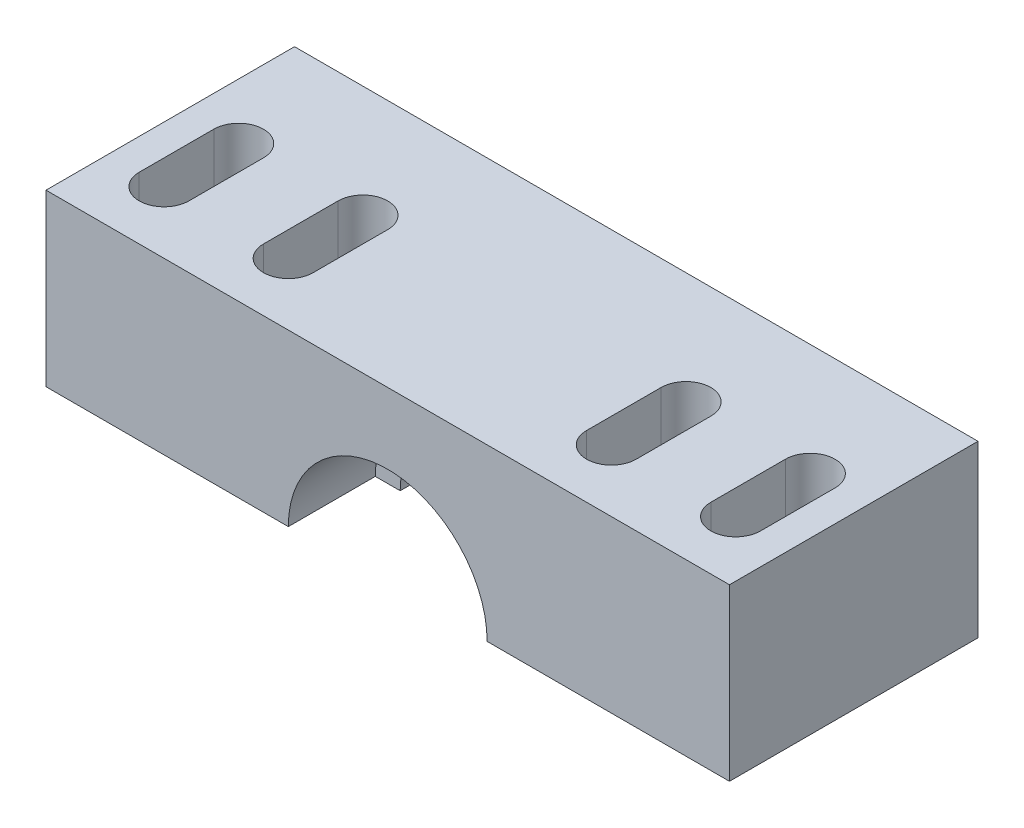
ISO-10303-21;
HEADER;
FILE_DESCRIPTION(('STEP AP214'),'2;1');
FILE_NAME('part.step','',(''),(''),'','','');
FILE_SCHEMA(('AUTOMOTIVE_DESIGN { 1 0 10303 214 1 1 1 1 }'));
ENDSEC;
DATA;
#1=APPLICATION_CONTEXT('core data for automotive mechanical design processes');
#2=APPLICATION_PROTOCOL_DEFINITION('international standard','automotive_design',2000,#1);
#3=PRODUCT_CONTEXT('',#1,'mechanical');
#4=PRODUCT('Part','Part','',(#3));
#5=PRODUCT_RELATED_PRODUCT_CATEGORY('part','',(#4));
#6=PRODUCT_DEFINITION_FORMATION('','',#4);
#7=PRODUCT_DEFINITION_CONTEXT('part definition',#1,'design');
#8=PRODUCT_DEFINITION('design','',#6,#7);
#9=PRODUCT_DEFINITION_SHAPE('','',#8);
#10=(LENGTH_UNIT() NAMED_UNIT(*) SI_UNIT(.MILLI.,.METRE.));
#11=(NAMED_UNIT(*) PLANE_ANGLE_UNIT() SI_UNIT($,.RADIAN.));
#12=(NAMED_UNIT(*) SI_UNIT($,.STERADIAN.) SOLID_ANGLE_UNIT());
#13=UNCERTAINTY_MEASURE_WITH_UNIT(LENGTH_MEASURE(1.E-05),#10,'distance_accuracy_value','');
#14=(GEOMETRIC_REPRESENTATION_CONTEXT(3) GLOBAL_UNCERTAINTY_ASSIGNED_CONTEXT((#13)) GLOBAL_UNIT_ASSIGNED_CONTEXT((#10,
#11,#12)) REPRESENTATION_CONTEXT('',''));
#15=CARTESIAN_POINT('',(0.,0.,0.));
#16=DIRECTION('',(0.,0.,1.));
#17=DIRECTION('',(1.,0.,0.));
#18=AXIS2_PLACEMENT_3D('',#15,#16,#17);
#19=CARTESIAN_POINT('',(-20.,0.,0.));
#20=DIRECTION('',(0.,0.,1.));
#21=DIRECTION('',(1.,0.,0.));
#22=AXIS2_PLACEMENT_3D('',#19,#20,#21);
#23=PLANE('',#22);
#24=CARTESIAN_POINT('',(-8.,0.,0.));
#25=DIRECTION('',(0.,0.,-1.));
#26=DIRECTION('',(1.,0.,0.));
#27=AXIS2_PLACEMENT_3D('',#24,#25,#26);
#28=CIRCLE('',#27,8.);
#29=CARTESIAN_POINT('',(-16.,0.,0.));
#30=VERTEX_POINT('',#29);
#31=CARTESIAN_POINT('',(0.,0.,0.));
#32=VERTEX_POINT('',#31);
#33=EDGE_CURVE('E396',#30,#32,#28,.T.);
#34=ORIENTED_EDGE('',*,*,#33,.T.);
#35=DIRECTION('',(1.,0.,0.));
#36=VECTOR('',#35,1.);
#37=CARTESIAN_POINT('',(4.,0.,0.));
#38=LINE('',#37,#36);
#39=CARTESIAN_POINT('',(19.5,0.,0.));
#40=VERTEX_POINT('',#39);
#41=EDGE_CURVE('E334',#32,#40,#38,.T.);
#42=ORIENTED_EDGE('',*,*,#41,.T.);
#43=DIRECTION('',(0.,1.,0.));
#44=VECTOR('',#43,1.);
#45=CARTESIAN_POINT('',(19.5,13.7,0.));
#46=LINE('',#45,#44);
#47=CARTESIAN_POINT('',(19.5,13.7,0.));
#48=VERTEX_POINT('',#47);
#49=EDGE_CURVE('E330',#40,#48,#46,.T.);
#50=ORIENTED_EDGE('',*,*,#49,.T.);
#51=DIRECTION('',(-1.,0.,0.));
#52=VECTOR('',#51,1.);
#53=CARTESIAN_POINT('',(-35.5,13.7,0.));
#54=LINE('',#53,#52);
#55=CARTESIAN_POINT('',(-35.5,13.7,0.));
#56=VERTEX_POINT('',#55);
#57=EDGE_CURVE('E326',#48,#56,#54,.T.);
#58=ORIENTED_EDGE('',*,*,#57,.T.);
#59=DIRECTION('',(0.,-1.,0.));
#60=VECTOR('',#59,1.);
#61=CARTESIAN_POINT('',(-35.5,0.,0.));
#62=LINE('',#61,#60);
#63=CARTESIAN_POINT('',(-35.5,0.,0.));
#64=VERTEX_POINT('',#63);
#65=EDGE_CURVE('E321',#56,#64,#62,.T.);
#66=ORIENTED_EDGE('',*,*,#65,.T.);
#67=DIRECTION('',(-1.,0.,0.));
#68=VECTOR('',#67,1.);
#69=CARTESIAN_POINT('',(-20.,0.,0.));
#70=LINE('',#69,#68);
#71=EDGE_CURVE('E356',#30,#64,#70,.T.);
#72=ORIENTED_EDGE('',*,*,#71,.F.);
#73=EDGE_LOOP('',(#34,#42,#50,#58,#66,#72));
#74=FACE_BOUND('',#73,.T.);
#75=ADVANCED_FACE('F35',(#74),#23,.T.);
#76=CARTESIAN_POINT('',(-8.,0.,0.));
#77=DIRECTION('',(0.,0.,1.));
#78=DIRECTION('',(1.,0.,0.));
#79=AXIS2_PLACEMENT_3D('',#76,#77,#78);
#80=CYLINDRICAL_SURFACE('',#79,8.);
#81=CARTESIAN_POINT('',(-8.,0.,-7.));
#82=DIRECTION('',(0.,0.,-1.));
#83=DIRECTION('',(1.,0.,0.));
#84=AXIS2_PLACEMENT_3D('',#81,#82,#83);
#85=CIRCLE('',#84,8.);
#86=CARTESIAN_POINT('',(-16.,0.,-7.));
#87=VERTEX_POINT('',#86);
#88=CARTESIAN_POINT('',(0.,0.,-7.));
#89=VERTEX_POINT('',#88);
#90=EDGE_CURVE('E393',#87,#89,#85,.T.);
#91=ORIENTED_EDGE('',*,*,#90,.T.);
#92=DIRECTION('',(0.,0.,1.));
#93=VECTOR('',#92,1.);
#94=CARTESIAN_POINT('',(0.,0.,0.));
#95=LINE('',#94,#93);
#96=EDGE_CURVE('E354',#89,#32,#95,.T.);
#97=ORIENTED_EDGE('',*,*,#96,.T.);
#98=ORIENTED_EDGE('',*,*,#33,.F.);
#99=DIRECTION('',(0.,0.,1.));
#100=VECTOR('',#99,1.);
#101=CARTESIAN_POINT('',(-16.,0.,0.));
#102=LINE('',#101,#100);
#103=EDGE_CURVE('E373',#87,#30,#102,.T.);
#104=ORIENTED_EDGE('',*,*,#103,.F.);
#105=EDGE_LOOP('',(#91,#97,#98,#104));
#106=FACE_BOUND('',#105,.T.);
#107=ADVANCED_FACE('F37',(#106),#80,.F.);
#108=CARTESIAN_POINT('',(-16.,0.,-7.));
#109=DIRECTION('',(0.,0.,1.));
#110=DIRECTION('',(1.,0.,0.));
#111=AXIS2_PLACEMENT_3D('',#108,#109,#110);
#112=PLANE('',#111);
#113=CARTESIAN_POINT('',(-8.,0.,-7.));
#114=DIRECTION('',(0.,0.,-1.));
#115=DIRECTION('',(1.,0.,0.));
#116=AXIS2_PLACEMENT_3D('',#113,#114,#115);
#117=CIRCLE('',#116,6.);
#118=CARTESIAN_POINT('',(-14.,0.,-7.));
#119=VERTEX_POINT('',#118);
#120=CARTESIAN_POINT('',(-2.,0.,-7.));
#121=VERTEX_POINT('',#120);
#122=EDGE_CURVE('E390',#119,#121,#117,.T.);
#123=ORIENTED_EDGE('',*,*,#122,.T.);
#124=DIRECTION('',(1.,0.,0.));
#125=VECTOR('',#124,1.);
#126=CARTESIAN_POINT('',(0.,0.,-7.));
#127=LINE('',#126,#125);
#128=EDGE_CURVE('E352',#121,#89,#127,.T.);
#129=ORIENTED_EDGE('',*,*,#128,.T.);
#130=ORIENTED_EDGE('',*,*,#90,.F.);
#131=DIRECTION('',(-1.,0.,0.));
#132=VECTOR('',#131,1.);
#133=CARTESIAN_POINT('',(-16.,0.,-7.));
#134=LINE('',#133,#132);
#135=EDGE_CURVE('E371',#119,#87,#134,.T.);
#136=ORIENTED_EDGE('',*,*,#135,.F.);
#137=EDGE_LOOP('',(#123,#129,#130,#136));
#138=FACE_BOUND('',#137,.T.);
#139=ADVANCED_FACE('F464',(#138),#112,.T.);
#140=CARTESIAN_POINT('',(-8.,0.,0.));
#141=DIRECTION('',(0.,0.,1.));
#142=DIRECTION('',(1.,0.,0.));
#143=AXIS2_PLACEMENT_3D('',#140,#141,#142);
#144=CYLINDRICAL_SURFACE('',#143,6.);
#145=CARTESIAN_POINT('',(-8.,0.,-13.));
#146=DIRECTION('',(0.,0.,-1.));
#147=DIRECTION('',(1.,0.,0.));
#148=AXIS2_PLACEMENT_3D('',#145,#146,#147);
#149=CIRCLE('',#148,6.);
#150=CARTESIAN_POINT('',(-14.,0.,-13.));
#151=VERTEX_POINT('',#150);
#152=CARTESIAN_POINT('',(-2.,0.,-13.));
#153=VERTEX_POINT('',#152);
#154=EDGE_CURVE('E387',#151,#153,#149,.T.);
#155=ORIENTED_EDGE('',*,*,#154,.T.);
#156=DIRECTION('',(0.,0.,1.));
#157=VECTOR('',#156,1.);
#158=CARTESIAN_POINT('',(-2.,0.,-7.));
#159=LINE('',#158,#157);
#160=EDGE_CURVE('E350',#153,#121,#159,.T.);
#161=ORIENTED_EDGE('',*,*,#160,.T.);
#162=ORIENTED_EDGE('',*,*,#122,.F.);
#163=DIRECTION('',(0.,0.,1.));
#164=VECTOR('',#163,1.);
#165=CARTESIAN_POINT('',(-14.,0.,-7.));
#166=LINE('',#165,#164);
#167=EDGE_CURVE('E369',#151,#119,#166,.T.);
#168=ORIENTED_EDGE('',*,*,#167,.F.);
#169=EDGE_LOOP('',(#155,#161,#162,#168));
#170=FACE_BOUND('',#169,.T.);
#171=ADVANCED_FACE('F488',(#170),#144,.F.);
#172=CARTESIAN_POINT('',(-14.,0.,-13.));
#173=DIRECTION('',(0.,0.,-1.));
#174=DIRECTION('',(-1.,0.,0.));
#175=AXIS2_PLACEMENT_3D('',#172,#173,#174);
#176=PLANE('',#175);
#177=CARTESIAN_POINT('',(-8.,0.,-13.));
#178=DIRECTION('',(0.,0.,-1.));
#179=DIRECTION('',(1.,0.,0.));
#180=AXIS2_PLACEMENT_3D('',#177,#178,#179);
#181=CIRCLE('',#180,8.);
#182=CARTESIAN_POINT('',(-16.,0.,-13.));
#183=VERTEX_POINT('',#182);
#184=CARTESIAN_POINT('',(0.,0.,-13.));
#185=VERTEX_POINT('',#184);
#186=EDGE_CURVE('E384',#183,#185,#181,.T.);
#187=ORIENTED_EDGE('',*,*,#186,.T.);
#188=DIRECTION('',(-1.,0.,0.));
#189=VECTOR('',#188,1.);
#190=CARTESIAN_POINT('',(-2.,0.,-13.));
#191=LINE('',#190,#189);
#192=EDGE_CURVE('E348',#185,#153,#191,.T.);
#193=ORIENTED_EDGE('',*,*,#192,.T.);
#194=ORIENTED_EDGE('',*,*,#154,.F.);
#195=DIRECTION('',(1.,0.,0.));
#196=VECTOR('',#195,1.);
#197=CARTESIAN_POINT('',(-14.,0.,-13.));
#198=LINE('',#197,#196);
#199=EDGE_CURVE('E367',#183,#151,#198,.T.);
#200=ORIENTED_EDGE('',*,*,#199,.F.);
#201=EDGE_LOOP('',(#187,#193,#194,#200));
#202=FACE_BOUND('',#201,.T.);
#203=ADVANCED_FACE('F484',(#202),#176,.T.);
#204=CARTESIAN_POINT('',(-8.,0.,0.));
#205=DIRECTION('',(0.,0.,1.));
#206=DIRECTION('',(1.,0.,0.));
#207=AXIS2_PLACEMENT_3D('',#204,#205,#206);
#208=CYLINDRICAL_SURFACE('',#207,8.);
#209=CARTESIAN_POINT('',(-8.,0.,-17.));
#210=DIRECTION('',(0.,0.,-1.));
#211=DIRECTION('',(1.,0.,0.));
#212=AXIS2_PLACEMENT_3D('',#209,#210,#211);
#213=CIRCLE('',#212,8.);
#214=CARTESIAN_POINT('',(-16.,0.,-17.));
#215=VERTEX_POINT('',#214);
#216=CARTESIAN_POINT('',(0.,0.,-17.));
#217=VERTEX_POINT('',#216);
#218=EDGE_CURVE('E381',#215,#217,#213,.T.);
#219=ORIENTED_EDGE('',*,*,#218,.T.);
#220=DIRECTION('',(0.,0.,1.));
#221=VECTOR('',#220,1.);
#222=CARTESIAN_POINT('',(0.,0.,-13.));
#223=LINE('',#222,#221);
#224=EDGE_CURVE('E346',#217,#185,#223,.T.);
#225=ORIENTED_EDGE('',*,*,#224,.T.);
#226=ORIENTED_EDGE('',*,*,#186,.F.);
#227=DIRECTION('',(0.,0.,1.));
#228=VECTOR('',#227,1.);
#229=CARTESIAN_POINT('',(-16.,0.,-13.));
#230=LINE('',#229,#228);
#231=EDGE_CURVE('E365',#215,#183,#230,.T.);
#232=ORIENTED_EDGE('',*,*,#231,.F.);
#233=EDGE_LOOP('',(#219,#225,#226,#232));
#234=FACE_BOUND('',#233,.T.);
#235=ADVANCED_FACE('F480',(#234),#208,.F.);
#236=CARTESIAN_POINT('',(-16.,0.,-17.));
#237=DIRECTION('',(0.,0.,1.));
#238=DIRECTION('',(1.,0.,0.));
#239=AXIS2_PLACEMENT_3D('',#236,#237,#238);
#240=PLANE('',#239);
#241=CARTESIAN_POINT('',(-8.,0.,-17.));
#242=DIRECTION('',(0.,0.,-1.));
#243=DIRECTION('',(1.,0.,0.));
#244=AXIS2_PLACEMENT_3D('',#241,#242,#243);
#245=CIRCLE('',#244,6.);
#246=CARTESIAN_POINT('',(-14.,0.,-17.));
#247=VERTEX_POINT('',#246);
#248=CARTESIAN_POINT('',(-2.,0.,-17.));
#249=VERTEX_POINT('',#248);
#250=EDGE_CURVE('E378',#247,#249,#245,.T.);
#251=ORIENTED_EDGE('',*,*,#250,.T.);
#252=DIRECTION('',(1.,0.,0.));
#253=VECTOR('',#252,1.);
#254=CARTESIAN_POINT('',(0.,0.,-17.));
#255=LINE('',#254,#253);
#256=EDGE_CURVE('E344',#249,#217,#255,.T.);
#257=ORIENTED_EDGE('',*,*,#256,.T.);
#258=ORIENTED_EDGE('',*,*,#218,.F.);
#259=DIRECTION('',(-1.,0.,0.));
#260=VECTOR('',#259,1.);
#261=CARTESIAN_POINT('',(-16.,0.,-17.));
#262=LINE('',#261,#260);
#263=EDGE_CURVE('E363',#247,#215,#262,.T.);
#264=ORIENTED_EDGE('',*,*,#263,.F.);
#265=EDGE_LOOP('',(#251,#257,#258,#264));
#266=FACE_BOUND('',#265,.T.);
#267=ADVANCED_FACE('F476',(#266),#240,.T.);
#268=CARTESIAN_POINT('',(-8.,0.,0.));
#269=DIRECTION('',(0.,0.,1.));
#270=DIRECTION('',(1.,0.,0.));
#271=AXIS2_PLACEMENT_3D('',#268,#269,#270);
#272=CYLINDRICAL_SURFACE('',#271,6.);
#273=CARTESIAN_POINT('',(-8.,0.,-20.));
#274=DIRECTION('',(0.,0.,-1.));
#275=DIRECTION('',(1.,0.,0.));
#276=AXIS2_PLACEMENT_3D('',#273,#274,#275);
#277=CIRCLE('',#276,6.);
#278=CARTESIAN_POINT('',(-14.,0.,-20.));
#279=VERTEX_POINT('',#278);
#280=CARTESIAN_POINT('',(-2.,0.,-20.));
#281=VERTEX_POINT('',#280);
#282=EDGE_CURVE('E375',#279,#281,#277,.T.);
#283=ORIENTED_EDGE('',*,*,#282,.T.);
#284=DIRECTION('',(0.,0.,1.));
#285=VECTOR('',#284,1.);
#286=CARTESIAN_POINT('',(-2.,0.,-17.));
#287=LINE('',#286,#285);
#288=EDGE_CURVE('E342',#281,#249,#287,.T.);
#289=ORIENTED_EDGE('',*,*,#288,.T.);
#290=ORIENTED_EDGE('',*,*,#250,.F.);
#291=DIRECTION('',(0.,0.,1.));
#292=VECTOR('',#291,1.);
#293=CARTESIAN_POINT('',(-14.,0.,-17.));
#294=LINE('',#293,#292);
#295=EDGE_CURVE('E361',#279,#247,#294,.T.);
#296=ORIENTED_EDGE('',*,*,#295,.F.);
#297=EDGE_LOOP('',(#283,#289,#290,#296));
#298=FACE_BOUND('',#297,.T.);
#299=ADVANCED_FACE('F472',(#298),#272,.F.);
#300=CARTESIAN_POINT('',(-14.,0.,-20.));
#301=DIRECTION('',(0.,0.,-1.));
#302=DIRECTION('',(-1.,0.,0.));
#303=AXIS2_PLACEMENT_3D('',#300,#301,#302);
#304=PLANE('',#303);
#305=DIRECTION('',(-1.,0.,0.));
#306=VECTOR('',#305,1.);
#307=CARTESIAN_POINT('',(-2.,0.,-20.));
#308=LINE('',#307,#306);
#309=CARTESIAN_POINT('',(19.5,0.,-20.));
#310=VERTEX_POINT('',#309);
#311=EDGE_CURVE('E340',#310,#281,#308,.T.);
#312=ORIENTED_EDGE('',*,*,#311,.T.);
#313=ORIENTED_EDGE('',*,*,#282,.F.);
#314=DIRECTION('',(1.,0.,0.));
#315=VECTOR('',#314,1.);
#316=CARTESIAN_POINT('',(-14.,0.,-20.));
#317=LINE('',#316,#315);
#318=CARTESIAN_POINT('',(-35.5,0.,-20.));
#319=VERTEX_POINT('',#318);
#320=EDGE_CURVE('E359',#319,#279,#317,.T.);
#321=ORIENTED_EDGE('',*,*,#320,.F.);
#322=DIRECTION('',(0.,-1.,0.));
#323=VECTOR('',#322,1.);
#324=CARTESIAN_POINT('',(-35.5,0.,-20.));
#325=LINE('',#324,#323);
#326=CARTESIAN_POINT('',(-35.5,13.7,-20.));
#327=VERTEX_POINT('',#326);
#328=EDGE_CURVE('E312',#327,#319,#325,.T.);
#329=ORIENTED_EDGE('',*,*,#328,.F.);
#330=DIRECTION('',(-1.,0.,0.));
#331=VECTOR('',#330,1.);
#332=CARTESIAN_POINT('',(-35.5,13.7,-20.));
#333=LINE('',#332,#331);
#334=CARTESIAN_POINT('',(19.5,13.7,-20.));
#335=VERTEX_POINT('',#334);
#336=EDGE_CURVE('E316',#335,#327,#333,.T.);
#337=ORIENTED_EDGE('',*,*,#336,.F.);
#338=DIRECTION('',(0.,1.,0.));
#339=VECTOR('',#338,1.);
#340=CARTESIAN_POINT('',(19.5,13.7,-20.));
#341=LINE('',#340,#339);
#342=EDGE_CURVE('E306',#310,#335,#341,.T.);
#343=ORIENTED_EDGE('',*,*,#342,.F.);
#344=EDGE_LOOP('',(#312,#313,#321,#329,#337,#343));
#345=FACE_BOUND('',#344,.T.);
#346=ADVANCED_FACE('F469',(#345),#304,.T.);
#347=CARTESIAN_POINT('',(-16.,0.,0.));
#348=DIRECTION('',(0.,-1.,0.));
#349=DIRECTION('',(0.,0.,-1.));
#350=AXIS2_PLACEMENT_3D('',#347,#348,#349);
#351=PLANE('',#350);
#352=CARTESIAN_POINT('',(-21.,-1.46642216231412E-13,-4.99999999999999));
#353=DIRECTION('',(0.,1.,0.));
#354=DIRECTION('',(1.,0.,0.));
#355=AXIS2_PLACEMENT_3D('',#352,#353,#354);
#356=CIRCLE('',#355,2.);
#357=CARTESIAN_POINT('',(-23.,-1.60608141586784E-13,-5.00000000000001));
#358=VERTEX_POINT('',#357);
#359=CARTESIAN_POINT('',(-19.,0.,-5.));
#360=VERTEX_POINT('',#359);
#361=EDGE_CURVE('E244',#358,#360,#356,.T.);
#362=ORIENTED_EDGE('',*,*,#361,.T.);
#363=DIRECTION('',(0.,0.,-1.));
#364=VECTOR('',#363,1.);
#365=CARTESIAN_POINT('',(-19.,-1.32676290876039E-13,-5.));
#366=LINE('',#365,#364);
#367=CARTESIAN_POINT('',(-19.,-1.32676290876039E-13,-11.));
#368=VERTEX_POINT('',#367);
#369=EDGE_CURVE('E225',#360,#368,#366,.T.);
#370=ORIENTED_EDGE('',*,*,#369,.T.);
#371=CARTESIAN_POINT('',(-21.,-1.46642216231412E-13,-11.));
#372=DIRECTION('',(0.,1.,0.));
#373=DIRECTION('',(1.,0.,0.));
#374=AXIS2_PLACEMENT_3D('',#371,#372,#373);
#375=CIRCLE('',#374,2.);
#376=CARTESIAN_POINT('',(-23.,-1.60608141586784E-13,-11.));
#377=VERTEX_POINT('',#376);
#378=EDGE_CURVE('E235',#368,#377,#375,.T.);
#379=ORIENTED_EDGE('',*,*,#378,.T.);
#380=DIRECTION('',(0.,0.,1.));
#381=VECTOR('',#380,1.);
#382=CARTESIAN_POINT('',(-23.,-1.60608141586784E-13,-5.00000000000001));
#383=LINE('',#382,#381);
#384=EDGE_CURVE('E240',#377,#358,#383,.T.);
#385=ORIENTED_EDGE('',*,*,#384,.T.);
#386=EDGE_LOOP('',(#362,#370,#379,#385));
#387=FACE_BOUND('',#386,.T.);
#388=CARTESIAN_POINT('',(-31.,-2.16471843008274E-13,-4.99999999999999));
#389=DIRECTION('',(0.,1.,0.));
#390=DIRECTION('',(-1.,0.,0.));
#391=AXIS2_PLACEMENT_3D('',#388,#389,#390);
#392=CIRCLE('',#391,2.);
#393=CARTESIAN_POINT('',(-33.,-2.30437768363647E-13,-4.99999999999999));
#394=VERTEX_POINT('',#393);
#395=CARTESIAN_POINT('',(-29.,-1.46642216231412E-13,-5.00000000000001));
#396=VERTEX_POINT('',#395);
#397=EDGE_CURVE('E252',#394,#396,#392,.T.);
#398=ORIENTED_EDGE('',*,*,#397,.T.);
#399=DIRECTION('',(0.,0.,-1.));
#400=VECTOR('',#399,1.);
#401=CARTESIAN_POINT('',(-29.,-2.02505917652902E-13,-5.00000000000001));
#402=LINE('',#401,#400);
#403=CARTESIAN_POINT('',(-29.,-2.02505917652902E-13,-11.));
#404=VERTEX_POINT('',#403);
#405=EDGE_CURVE('E294',#396,#404,#402,.T.);
#406=ORIENTED_EDGE('',*,*,#405,.T.);
#407=CARTESIAN_POINT('',(-31.,-2.16471843008274E-13,-11.));
#408=DIRECTION('',(0.,1.,0.));
#409=DIRECTION('',(-1.,0.,0.));
#410=AXIS2_PLACEMENT_3D('',#407,#408,#409);
#411=CIRCLE('',#410,2.);
#412=CARTESIAN_POINT('',(-33.,-2.30437768363647E-13,-11.));
#413=VERTEX_POINT('',#412);
#414=EDGE_CURVE('E297',#404,#413,#411,.T.);
#415=ORIENTED_EDGE('',*,*,#414,.T.);
#416=DIRECTION('',(0.,0.,1.));
#417=VECTOR('',#416,1.);
#418=CARTESIAN_POINT('',(-33.,-2.30437768363647E-13,-4.99999999999999));
#419=LINE('',#418,#417);
#420=EDGE_CURVE('E300',#413,#394,#419,.T.);
#421=ORIENTED_EDGE('',*,*,#420,.T.);
#422=EDGE_LOOP('',(#398,#406,#415,#421));
#423=FACE_BOUND('',#422,.T.);
#424=ORIENTED_EDGE('',*,*,#71,.T.);
#425=DIRECTION('',(0.,0.,-1.));
#426=VECTOR('',#425,1.);
#427=CARTESIAN_POINT('',(-35.5,0.,56.6805963271383));
#428=LINE('',#427,#426);
#429=EDGE_CURVE('E324',#64,#319,#428,.T.);
#430=ORIENTED_EDGE('',*,*,#429,.T.);
#431=ORIENTED_EDGE('',*,*,#320,.T.);
#432=ORIENTED_EDGE('',*,*,#295,.T.);
#433=ORIENTED_EDGE('',*,*,#263,.T.);
#434=ORIENTED_EDGE('',*,*,#231,.T.);
#435=ORIENTED_EDGE('',*,*,#199,.T.);
#436=ORIENTED_EDGE('',*,*,#167,.T.);
#437=ORIENTED_EDGE('',*,*,#135,.T.);
#438=ORIENTED_EDGE('',*,*,#103,.T.);
#439=EDGE_LOOP('',(#424,#430,#431,#432,#433,#434,#435,#436,#437,#438));
#440=FACE_BOUND('',#439,.T.);
#441=ADVANCED_FACE('F242',(#387,#423,#440),#351,.T.);
#442=CARTESIAN_POINT('',(0.,0.,0.));
#443=DIRECTION('',(0.,1.,0.));
#444=DIRECTION('',(0.,0.,-1.));
#445=AXIS2_PLACEMENT_3D('',#442,#443,#444);
#446=PLANE('',#445);
#447=DIRECTION('',(0.,0.,-1.));
#448=VECTOR('',#447,1.);
#449=CARTESIAN_POINT('',(7.,0.,-5.00000000000001));
#450=LINE('',#449,#448);
#451=CARTESIAN_POINT('',(7.,0.,-5.00000000000001));
#452=VERTEX_POINT('',#451);
#453=CARTESIAN_POINT('',(7.,0.,-11.));
#454=VERTEX_POINT('',#453);
#455=EDGE_CURVE('E257',#452,#454,#450,.T.);
#456=ORIENTED_EDGE('',*,*,#455,.T.);
#457=CARTESIAN_POINT('',(5.,0.,-11.));
#458=DIRECTION('',(0.,1.,0.));
#459=DIRECTION('',(-1.,0.,0.));
#460=AXIS2_PLACEMENT_3D('',#457,#458,#459);
#461=CIRCLE('',#460,2.);
#462=CARTESIAN_POINT('',(3.,0.,-11.));
#463=VERTEX_POINT('',#462);
#464=EDGE_CURVE('E261',#454,#463,#461,.T.);
#465=ORIENTED_EDGE('',*,*,#464,.T.);
#466=DIRECTION('',(0.,0.,1.));
#467=VECTOR('',#466,1.);
#468=CARTESIAN_POINT('',(3.,0.,-5.00000000000001));
#469=LINE('',#468,#467);
#470=CARTESIAN_POINT('',(3.,0.,-5.00000000000001));
#471=VERTEX_POINT('',#470);
#472=EDGE_CURVE('E264',#463,#471,#469,.T.);
#473=ORIENTED_EDGE('',*,*,#472,.T.);
#474=CARTESIAN_POINT('',(5.00000000000001,0.,-5.));
#475=DIRECTION('',(0.,1.,0.));
#476=DIRECTION('',(-1.,0.,0.));
#477=AXIS2_PLACEMENT_3D('',#474,#475,#476);
#478=CIRCLE('',#477,2.);
#479=EDGE_CURVE('E255',#471,#452,#478,.T.);
#480=ORIENTED_EDGE('',*,*,#479,.T.);
#481=EDGE_LOOP('',(#456,#465,#473,#480));
#482=FACE_BOUND('',#481,.T.);
#483=DIRECTION('',(0.,0.,-1.));
#484=VECTOR('',#483,1.);
#485=CARTESIAN_POINT('',(17.,1.18710365520667E-13,-5.00000000000001));
#486=LINE('',#485,#484);
#487=CARTESIAN_POINT('',(17.,0.,-5.00000000000001));
#488=VERTEX_POINT('',#487);
#489=CARTESIAN_POINT('',(17.,1.18710365520667E-13,-11.));
#490=VERTEX_POINT('',#489);
#491=EDGE_CURVE('E276',#488,#490,#486,.T.);
#492=ORIENTED_EDGE('',*,*,#491,.T.);
#493=CARTESIAN_POINT('',(15.,1.04744440165294E-13,-11.));
#494=DIRECTION('',(0.,1.,0.));
#495=DIRECTION('',(1.,0.,0.));
#496=AXIS2_PLACEMENT_3D('',#493,#494,#495);
#497=CIRCLE('',#496,2.);
#498=CARTESIAN_POINT('',(13.,0.,-11.));
#499=VERTEX_POINT('',#498);
#500=EDGE_CURVE('E279',#490,#499,#497,.T.);
#501=ORIENTED_EDGE('',*,*,#500,.T.);
#502=DIRECTION('',(0.,0.,1.));
#503=VECTOR('',#502,1.);
#504=CARTESIAN_POINT('',(13.,0.,-5.00000000000001));
#505=LINE('',#504,#503);
#506=CARTESIAN_POINT('',(13.,0.,-5.00000000000001));
#507=VERTEX_POINT('',#506);
#508=EDGE_CURVE('E282',#499,#507,#505,.T.);
#509=ORIENTED_EDGE('',*,*,#508,.T.);
#510=CARTESIAN_POINT('',(15.,1.04744440165294E-13,-4.99999999999999));
#511=DIRECTION('',(0.,1.,0.));
#512=DIRECTION('',(1.,0.,0.));
#513=AXIS2_PLACEMENT_3D('',#510,#511,#512);
#514=CIRCLE('',#513,2.);
#515=EDGE_CURVE('E273',#507,#488,#514,.T.);
#516=ORIENTED_EDGE('',*,*,#515,.T.);
#517=EDGE_LOOP('',(#492,#501,#509,#516));
#518=FACE_BOUND('',#517,.T.);
#519=ORIENTED_EDGE('',*,*,#41,.F.);
#520=ORIENTED_EDGE('',*,*,#96,.F.);
#521=ORIENTED_EDGE('',*,*,#128,.F.);
#522=ORIENTED_EDGE('',*,*,#160,.F.);
#523=ORIENTED_EDGE('',*,*,#192,.F.);
#524=ORIENTED_EDGE('',*,*,#224,.F.);
#525=ORIENTED_EDGE('',*,*,#256,.F.);
#526=ORIENTED_EDGE('',*,*,#288,.F.);
#527=ORIENTED_EDGE('',*,*,#311,.F.);
#528=DIRECTION('',(0.,0.,-1.));
#529=VECTOR('',#528,1.);
#530=CARTESIAN_POINT('',(19.5,0.,56.6805963271383));
#531=LINE('',#530,#529);
#532=EDGE_CURVE('E315',#40,#310,#531,.T.);
#533=ORIENTED_EDGE('',*,*,#532,.F.);
#534=EDGE_LOOP('',(#519,#520,#521,#522,#523,#524,#525,#526,#527,#533));
#535=FACE_BOUND('',#534,.T.);
#536=ADVANCED_FACE('F507',(#482,#518,#535),#446,.F.);
#537=CARTESIAN_POINT('',(19.5,13.7,56.6805963271383));
#538=DIRECTION('',(1.,0.,0.));
#539=DIRECTION('',(0.,0.,-1.));
#540=AXIS2_PLACEMENT_3D('',#537,#538,#539);
#541=PLANE('',#540);
#542=ORIENTED_EDGE('',*,*,#532,.T.);
#543=ORIENTED_EDGE('',*,*,#342,.T.);
#544=DIRECTION('',(0.,0.,-1.));
#545=VECTOR('',#544,1.);
#546=CARTESIAN_POINT('',(19.5,13.7,56.6805963271383));
#547=LINE('',#546,#545);
#548=EDGE_CURVE('E329',#48,#335,#547,.T.);
#549=ORIENTED_EDGE('',*,*,#548,.F.);
#550=ORIENTED_EDGE('',*,*,#49,.F.);
#551=EDGE_LOOP('',(#542,#543,#549,#550));
#552=FACE_BOUND('',#551,.T.);
#553=ADVANCED_FACE('F534',(#552),#541,.T.);
#554=CARTESIAN_POINT('',(-35.5,13.7,56.6805963271383));
#555=DIRECTION('',(0.,1.,0.));
#556=DIRECTION('',(1.,0.,0.));
#557=AXIS2_PLACEMENT_3D('',#554,#555,#556);
#558=PLANE('',#557);
#559=CARTESIAN_POINT('',(-21.0000000000001,13.7,-4.99999999999999));
#560=DIRECTION('',(0.,-1.,0.));
#561=DIRECTION('',(1.,0.,0.));
#562=AXIS2_PLACEMENT_3D('',#559,#560,#561);
#563=CIRCLE('',#562,2.);
#564=CARTESIAN_POINT('',(-19.0000000000001,13.7,-5.));
#565=VERTEX_POINT('',#564);
#566=CARTESIAN_POINT('',(-23.0000000000001,13.7,-5.00000000000001));
#567=VERTEX_POINT('',#566);
#568=EDGE_CURVE('E11',#565,#567,#563,.T.);
#569=ORIENTED_EDGE('',*,*,#568,.T.);
#570=DIRECTION('',(0.,0.,-1.));
#571=VECTOR('',#570,1.);
#572=CARTESIAN_POINT('',(-23.0000000000001,13.7,56.6805963271383));
#573=LINE('',#572,#571);
#574=CARTESIAN_POINT('',(-23.0000000000001,13.7,-11.));
#575=VERTEX_POINT('',#574);
#576=EDGE_CURVE('E43',#567,#575,#573,.T.);
#577=ORIENTED_EDGE('',*,*,#576,.T.);
#578=CARTESIAN_POINT('',(-21.0000000000001,13.7,-11.));
#579=DIRECTION('',(0.,-1.,0.));
#580=DIRECTION('',(1.,0.,0.));
#581=AXIS2_PLACEMENT_3D('',#578,#579,#580);
#582=CIRCLE('',#581,2.);
#583=CARTESIAN_POINT('',(-19.0000000000001,13.7,-11.));
#584=VERTEX_POINT('',#583);
#585=EDGE_CURVE('E436',#575,#584,#582,.T.);
#586=ORIENTED_EDGE('',*,*,#585,.T.);
#587=DIRECTION('',(0.,0.,1.));
#588=VECTOR('',#587,1.);
#589=CARTESIAN_POINT('',(-19.0000000000001,13.7,56.6805963271383));
#590=LINE('',#589,#588);
#591=EDGE_CURVE('E228',#584,#565,#590,.T.);
#592=ORIENTED_EDGE('',*,*,#591,.T.);
#593=EDGE_LOOP('',(#569,#577,#586,#592));
#594=FACE_BOUND('',#593,.T.);
#595=CARTESIAN_POINT('',(4.99999999999991,13.7,-5.));
#596=DIRECTION('',(0.,-1.,0.));
#597=DIRECTION('',(1.,0.,0.));
#598=AXIS2_PLACEMENT_3D('',#595,#596,#597);
#599=CIRCLE('',#598,2.);
#600=CARTESIAN_POINT('',(6.9999999999999,13.7,-5.00000000000001));
#601=VERTEX_POINT('',#600);
#602=CARTESIAN_POINT('',(2.99999999999991,13.7,-5.00000000000001));
#603=VERTEX_POINT('',#602);
#604=EDGE_CURVE('E432',#601,#603,#599,.T.);
#605=ORIENTED_EDGE('',*,*,#604,.T.);
#606=DIRECTION('',(0.,0.,-1.));
#607=VECTOR('',#606,1.);
#608=CARTESIAN_POINT('',(2.99999999999992,13.7,56.6805963271383));
#609=LINE('',#608,#607);
#610=CARTESIAN_POINT('',(2.99999999999991,13.7,-11.));
#611=VERTEX_POINT('',#610);
#612=EDGE_CURVE('E429',#603,#611,#609,.T.);
#613=ORIENTED_EDGE('',*,*,#612,.T.);
#614=CARTESIAN_POINT('',(4.99999999999991,13.7,-11.));
#615=DIRECTION('',(0.,-1.,0.));
#616=DIRECTION('',(1.,0.,0.));
#617=AXIS2_PLACEMENT_3D('',#614,#615,#616);
#618=CIRCLE('',#617,2.);
#619=CARTESIAN_POINT('',(6.9999999999999,13.7,-11.));
#620=VERTEX_POINT('',#619);
#621=EDGE_CURVE('E426',#611,#620,#618,.T.);
#622=ORIENTED_EDGE('',*,*,#621,.T.);
#623=DIRECTION('',(0.,0.,1.));
#624=VECTOR('',#623,1.);
#625=CARTESIAN_POINT('',(6.99999999999991,13.7,56.6805963271383));
#626=LINE('',#625,#624);
#627=EDGE_CURVE('E423',#620,#601,#626,.T.);
#628=ORIENTED_EDGE('',*,*,#627,.T.);
#629=EDGE_LOOP('',(#605,#613,#622,#628));
#630=FACE_BOUND('',#629,.T.);
#631=CARTESIAN_POINT('',(14.9999999999999,13.7,-4.99999999999999));
#632=DIRECTION('',(0.,-1.,0.));
#633=DIRECTION('',(1.,0.,0.));
#634=AXIS2_PLACEMENT_3D('',#631,#632,#633);
#635=CIRCLE('',#634,2.);
#636=CARTESIAN_POINT('',(16.9999999999999,13.7,-5.00000000000001));
#637=VERTEX_POINT('',#636);
#638=CARTESIAN_POINT('',(12.9999999999999,13.7,-5.00000000000001));
#639=VERTEX_POINT('',#638);
#640=EDGE_CURVE('E420',#637,#639,#635,.T.);
#641=ORIENTED_EDGE('',*,*,#640,.T.);
#642=DIRECTION('',(0.,0.,-1.));
#643=VECTOR('',#642,1.);
#644=CARTESIAN_POINT('',(12.9999999999999,13.7,56.6805963271383));
#645=LINE('',#644,#643);
#646=CARTESIAN_POINT('',(12.9999999999999,13.7,-11.));
#647=VERTEX_POINT('',#646);
#648=EDGE_CURVE('E417',#639,#647,#645,.T.);
#649=ORIENTED_EDGE('',*,*,#648,.T.);
#650=CARTESIAN_POINT('',(14.9999999999999,13.7,-11.));
#651=DIRECTION('',(0.,-1.,0.));
#652=DIRECTION('',(1.,0.,0.));
#653=AXIS2_PLACEMENT_3D('',#650,#651,#652);
#654=CIRCLE('',#653,2.);
#655=CARTESIAN_POINT('',(16.9999999999999,13.7,-11.));
#656=VERTEX_POINT('',#655);
#657=EDGE_CURVE('E414',#647,#656,#654,.T.);
#658=ORIENTED_EDGE('',*,*,#657,.T.);
#659=DIRECTION('',(0.,0.,1.));
#660=VECTOR('',#659,1.);
#661=CARTESIAN_POINT('',(16.9999999999999,13.7,56.6805963271383));
#662=LINE('',#661,#660);
#663=EDGE_CURVE('E411',#656,#637,#662,.T.);
#664=ORIENTED_EDGE('',*,*,#663,.T.);
#665=EDGE_LOOP('',(#641,#649,#658,#664));
#666=FACE_BOUND('',#665,.T.);
#667=CARTESIAN_POINT('',(-31.0000000000001,13.7,-4.99999999999999));
#668=DIRECTION('',(0.,-1.,0.));
#669=DIRECTION('',(1.,0.,0.));
#670=AXIS2_PLACEMENT_3D('',#667,#668,#669);
#671=CIRCLE('',#670,2.);
#672=CARTESIAN_POINT('',(-29.0000000000001,13.7,-5.00000000000001));
#673=VERTEX_POINT('',#672);
#674=CARTESIAN_POINT('',(-33.0000000000001,13.7,-4.99999999999999));
#675=VERTEX_POINT('',#674);
#676=EDGE_CURVE('E408',#673,#675,#671,.T.);
#677=ORIENTED_EDGE('',*,*,#676,.T.);
#678=DIRECTION('',(0.,0.,-1.));
#679=VECTOR('',#678,1.);
#680=CARTESIAN_POINT('',(-33.0000000000001,13.7,56.6805963271383));
#681=LINE('',#680,#679);
#682=CARTESIAN_POINT('',(-33.0000000000001,13.7,-11.));
#683=VERTEX_POINT('',#682);
#684=EDGE_CURVE('E405',#675,#683,#681,.T.);
#685=ORIENTED_EDGE('',*,*,#684,.T.);
#686=CARTESIAN_POINT('',(-31.0000000000001,13.7,-11.));
#687=DIRECTION('',(0.,-1.,0.));
#688=DIRECTION('',(1.,0.,0.));
#689=AXIS2_PLACEMENT_3D('',#686,#687,#688);
#690=CIRCLE('',#689,2.);
#691=CARTESIAN_POINT('',(-29.0000000000001,13.7,-11.));
#692=VERTEX_POINT('',#691);
#693=EDGE_CURVE('E402',#683,#692,#690,.T.);
#694=ORIENTED_EDGE('',*,*,#693,.T.);
#695=DIRECTION('',(0.,0.,1.));
#696=VECTOR('',#695,1.);
#697=CARTESIAN_POINT('',(-29.0000000000001,13.7,56.6805963271383));
#698=LINE('',#697,#696);
#699=EDGE_CURVE('E399',#692,#673,#698,.T.);
#700=ORIENTED_EDGE('',*,*,#699,.T.);
#701=EDGE_LOOP('',(#677,#685,#694,#700));
#702=FACE_BOUND('',#701,.T.);
#703=ORIENTED_EDGE('',*,*,#548,.T.);
#704=ORIENTED_EDGE('',*,*,#336,.T.);
#705=DIRECTION('',(0.,0.,-1.));
#706=VECTOR('',#705,1.);
#707=CARTESIAN_POINT('',(-35.5,13.7,56.6805963271383));
#708=LINE('',#707,#706);
#709=EDGE_CURVE('E325',#56,#327,#708,.T.);
#710=ORIENTED_EDGE('',*,*,#709,.F.);
#711=ORIENTED_EDGE('',*,*,#57,.F.);
#712=EDGE_LOOP('',(#703,#704,#710,#711));
#713=FACE_BOUND('',#712,.T.);
#714=ADVANCED_FACE('F440',(#594,#630,#666,#702,#713),#558,.T.);
#715=CARTESIAN_POINT('',(-35.5,0.,56.6805963271383));
#716=DIRECTION('',(-1.,0.,0.));
#717=DIRECTION('',(0.,0.,1.));
#718=AXIS2_PLACEMENT_3D('',#715,#716,#717);
#719=PLANE('',#718);
#720=ORIENTED_EDGE('',*,*,#709,.T.);
#721=ORIENTED_EDGE('',*,*,#328,.T.);
#722=ORIENTED_EDGE('',*,*,#429,.F.);
#723=ORIENTED_EDGE('',*,*,#65,.F.);
#724=EDGE_LOOP('',(#720,#721,#722,#723));
#725=FACE_BOUND('',#724,.T.);
#726=ADVANCED_FACE('F515',(#725),#719,.T.);
#727=CARTESIAN_POINT('',(-31.0000000000001,19.9999999999998,-4.99999999999999));
#728=DIRECTION('',(0.,-1.,0.));
#729=DIRECTION('',(-1.,0.,0.));
#730=AXIS2_PLACEMENT_3D('',#727,#728,#729);
#731=CYLINDRICAL_SURFACE('',#730,2.);
#732=ORIENTED_EDGE('',*,*,#676,.F.);
#733=DIRECTION('',(0.,-1.,0.));
#734=VECTOR('',#733,1.);
#735=CARTESIAN_POINT('',(-29.0000000000001,19.9999999999998,-5.00000000000001));
#736=LINE('',#735,#734);
#737=EDGE_CURVE('E303',#673,#396,#736,.T.);
#738=ORIENTED_EDGE('',*,*,#737,.T.);
#739=ORIENTED_EDGE('',*,*,#397,.F.);
#740=DIRECTION('',(0.,-1.,0.));
#741=VECTOR('',#740,1.);
#742=CARTESIAN_POINT('',(-33.0000000000001,19.9999999999998,-4.99999999999999));
#743=LINE('',#742,#741);
#744=EDGE_CURVE('E304',#675,#394,#743,.T.);
#745=ORIENTED_EDGE('',*,*,#744,.F.);
#746=EDGE_LOOP('',(#732,#738,#739,#745));
#747=FACE_BOUND('',#746,.T.);
#748=ADVANCED_FACE('F542',(#747),#731,.F.);
#749=CARTESIAN_POINT('',(-33.0000000000001,19.9999999999998,-4.99999999999999));
#750=DIRECTION('',(-1.,0.,0.));
#751=DIRECTION('',(0.,1.,0.));
#752=AXIS2_PLACEMENT_3D('',#749,#750,#751);
#753=PLANE('',#752);
#754=ORIENTED_EDGE('',*,*,#684,.F.);
#755=ORIENTED_EDGE('',*,*,#744,.T.);
#756=ORIENTED_EDGE('',*,*,#420,.F.);
#757=DIRECTION('',(0.,-1.,0.));
#758=VECTOR('',#757,1.);
#759=CARTESIAN_POINT('',(-33.0000000000001,19.9999999999998,-11.));
#760=LINE('',#759,#758);
#761=EDGE_CURVE('E307',#683,#413,#760,.T.);
#762=ORIENTED_EDGE('',*,*,#761,.F.);
#763=EDGE_LOOP('',(#754,#755,#756,#762));
#764=FACE_BOUND('',#763,.T.);
#765=ADVANCED_FACE('F579',(#764),#753,.F.);
#766=CARTESIAN_POINT('',(-31.0000000000001,19.9999999999998,-11.));
#767=DIRECTION('',(0.,-1.,0.));
#768=DIRECTION('',(-1.,0.,0.));
#769=AXIS2_PLACEMENT_3D('',#766,#767,#768);
#770=CYLINDRICAL_SURFACE('',#769,2.);
#771=ORIENTED_EDGE('',*,*,#693,.F.);
#772=ORIENTED_EDGE('',*,*,#761,.T.);
#773=ORIENTED_EDGE('',*,*,#414,.F.);
#774=DIRECTION('',(0.,-1.,0.));
#775=VECTOR('',#774,1.);
#776=CARTESIAN_POINT('',(-29.0000000000001,19.9999999999998,-11.));
#777=LINE('',#776,#775);
#778=EDGE_CURVE('E309',#692,#404,#777,.T.);
#779=ORIENTED_EDGE('',*,*,#778,.F.);
#780=EDGE_LOOP('',(#771,#772,#773,#779));
#781=FACE_BOUND('',#780,.T.);
#782=ADVANCED_FACE('F583',(#781),#770,.F.);
#783=CARTESIAN_POINT('',(-29.0000000000001,19.9999999999998,-5.00000000000001));
#784=DIRECTION('',(1.,0.,0.));
#785=DIRECTION('',(0.,-1.,0.));
#786=AXIS2_PLACEMENT_3D('',#783,#784,#785);
#787=PLANE('',#786);
#788=ORIENTED_EDGE('',*,*,#699,.F.);
#789=ORIENTED_EDGE('',*,*,#778,.T.);
#790=ORIENTED_EDGE('',*,*,#405,.F.);
#791=ORIENTED_EDGE('',*,*,#737,.F.);
#792=EDGE_LOOP('',(#788,#789,#790,#791));
#793=FACE_BOUND('',#792,.T.);
#794=ADVANCED_FACE('F585',(#793),#787,.F.);
#795=CARTESIAN_POINT('',(14.9999999999999,20.0000000000001,-4.99999999999999));
#796=DIRECTION('',(0.,-1.,0.));
#797=DIRECTION('',(-1.,0.,0.));
#798=AXIS2_PLACEMENT_3D('',#795,#796,#797);
#799=CYLINDRICAL_SURFACE('',#798,2.);
#800=ORIENTED_EDGE('',*,*,#640,.F.);
#801=DIRECTION('',(0.,-1.,0.));
#802=VECTOR('',#801,1.);
#803=CARTESIAN_POINT('',(16.9999999999999,20.0000000000001,-5.00000000000001));
#804=LINE('',#803,#802);
#805=EDGE_CURVE('E285',#637,#488,#804,.T.);
#806=ORIENTED_EDGE('',*,*,#805,.T.);
#807=ORIENTED_EDGE('',*,*,#515,.F.);
#808=DIRECTION('',(0.,-1.,0.));
#809=VECTOR('',#808,1.);
#810=CARTESIAN_POINT('',(12.9999999999999,20.0000000000001,-5.00000000000001));
#811=LINE('',#810,#809);
#812=EDGE_CURVE('E258',#639,#507,#811,.T.);
#813=ORIENTED_EDGE('',*,*,#812,.F.);
#814=EDGE_LOOP('',(#800,#806,#807,#813));
#815=FACE_BOUND('',#814,.T.);
#816=ADVANCED_FACE('F568',(#815),#799,.F.);
#817=CARTESIAN_POINT('',(12.9999999999999,20.0000000000001,-5.00000000000001));
#818=DIRECTION('',(-1.,0.,0.));
#819=DIRECTION('',(0.,1.,0.));
#820=AXIS2_PLACEMENT_3D('',#817,#818,#819);
#821=PLANE('',#820);
#822=ORIENTED_EDGE('',*,*,#648,.F.);
#823=ORIENTED_EDGE('',*,*,#812,.T.);
#824=ORIENTED_EDGE('',*,*,#508,.F.);
#825=DIRECTION('',(0.,-1.,0.));
#826=VECTOR('',#825,1.);
#827=CARTESIAN_POINT('',(12.9999999999999,20.0000000000001,-11.));
#828=LINE('',#827,#826);
#829=EDGE_CURVE('E287',#647,#499,#828,.T.);
#830=ORIENTED_EDGE('',*,*,#829,.F.);
#831=EDGE_LOOP('',(#822,#823,#824,#830));
#832=FACE_BOUND('',#831,.T.);
#833=ADVANCED_FACE('F565',(#832),#821,.F.);
#834=CARTESIAN_POINT('',(14.9999999999999,20.0000000000001,-11.));
#835=DIRECTION('',(0.,-1.,0.));
#836=DIRECTION('',(-1.,0.,0.));
#837=AXIS2_PLACEMENT_3D('',#834,#835,#836);
#838=CYLINDRICAL_SURFACE('',#837,2.);
#839=ORIENTED_EDGE('',*,*,#657,.F.);
#840=ORIENTED_EDGE('',*,*,#829,.T.);
#841=ORIENTED_EDGE('',*,*,#500,.F.);
#842=DIRECTION('',(0.,-1.,0.));
#843=VECTOR('',#842,1.);
#844=CARTESIAN_POINT('',(16.9999999999999,20.0000000000001,-11.));
#845=LINE('',#844,#843);
#846=EDGE_CURVE('E289',#656,#490,#845,.T.);
#847=ORIENTED_EDGE('',*,*,#846,.F.);
#848=EDGE_LOOP('',(#839,#840,#841,#847));
#849=FACE_BOUND('',#848,.T.);
#850=ADVANCED_FACE('F561',(#849),#838,.F.);
#851=CARTESIAN_POINT('',(16.9999999999999,20.0000000000001,-5.00000000000001));
#852=DIRECTION('',(1.,0.,0.));
#853=DIRECTION('',(0.,-1.,0.));
#854=AXIS2_PLACEMENT_3D('',#851,#852,#853);
#855=PLANE('',#854);
#856=ORIENTED_EDGE('',*,*,#663,.F.);
#857=ORIENTED_EDGE('',*,*,#846,.T.);
#858=ORIENTED_EDGE('',*,*,#491,.F.);
#859=ORIENTED_EDGE('',*,*,#805,.F.);
#860=EDGE_LOOP('',(#856,#857,#858,#859));
#861=FACE_BOUND('',#860,.T.);
#862=ADVANCED_FACE('F558',(#861),#855,.F.);
#863=CARTESIAN_POINT('',(4.99999999999987,20.,-5.));
#864=DIRECTION('',(0.,-1.,0.));
#865=DIRECTION('',(-1.,0.,0.));
#866=AXIS2_PLACEMENT_3D('',#863,#864,#865);
#867=CYLINDRICAL_SURFACE('',#866,2.);
#868=ORIENTED_EDGE('',*,*,#604,.F.);
#869=DIRECTION('',(0.,-1.,0.));
#870=VECTOR('',#869,1.);
#871=CARTESIAN_POINT('',(6.99999999999986,20.0000000000001,-5.00000000000001));
#872=LINE('',#871,#870);
#873=EDGE_CURVE('E58',#601,#452,#872,.T.);
#874=ORIENTED_EDGE('',*,*,#873,.T.);
#875=ORIENTED_EDGE('',*,*,#479,.F.);
#876=DIRECTION('',(0.,-1.,0.));
#877=VECTOR('',#876,1.);
#878=CARTESIAN_POINT('',(2.99999999999986,20.,-5.00000000000001));
#879=LINE('',#878,#877);
#880=EDGE_CURVE('E246',#603,#471,#879,.T.);
#881=ORIENTED_EDGE('',*,*,#880,.F.);
#882=EDGE_LOOP('',(#868,#874,#875,#881));
#883=FACE_BOUND('',#882,.T.);
#884=ADVANCED_FACE('F604',(#883),#867,.F.);
#885=CARTESIAN_POINT('',(2.99999999999986,20.,-5.00000000000001));
#886=DIRECTION('',(-1.,0.,0.));
#887=DIRECTION('',(0.,1.,0.));
#888=AXIS2_PLACEMENT_3D('',#885,#886,#887);
#889=PLANE('',#888);
#890=ORIENTED_EDGE('',*,*,#612,.F.);
#891=ORIENTED_EDGE('',*,*,#880,.T.);
#892=ORIENTED_EDGE('',*,*,#472,.F.);
#893=DIRECTION('',(0.,-1.,0.));
#894=VECTOR('',#893,1.);
#895=CARTESIAN_POINT('',(2.99999999999986,20.,-11.));
#896=LINE('',#895,#894);
#897=EDGE_CURVE('E268',#611,#463,#896,.T.);
#898=ORIENTED_EDGE('',*,*,#897,.F.);
#899=EDGE_LOOP('',(#890,#891,#892,#898));
#900=FACE_BOUND('',#899,.T.);
#901=ADVANCED_FACE('F610',(#900),#889,.F.);
#902=CARTESIAN_POINT('',(4.99999999999986,20.,-11.));
#903=DIRECTION('',(0.,-1.,0.));
#904=DIRECTION('',(-1.,0.,0.));
#905=AXIS2_PLACEMENT_3D('',#902,#903,#904);
#906=CYLINDRICAL_SURFACE('',#905,2.);
#907=ORIENTED_EDGE('',*,*,#621,.F.);
#908=ORIENTED_EDGE('',*,*,#897,.T.);
#909=ORIENTED_EDGE('',*,*,#464,.F.);
#910=DIRECTION('',(0.,-1.,0.));
#911=VECTOR('',#910,1.);
#912=CARTESIAN_POINT('',(6.99999999999986,20.0000000000001,-11.));
#913=LINE('',#912,#911);
#914=EDGE_CURVE('E270',#620,#454,#913,.T.);
#915=ORIENTED_EDGE('',*,*,#914,.F.);
#916=EDGE_LOOP('',(#907,#908,#909,#915));
#917=FACE_BOUND('',#916,.T.);
#918=ADVANCED_FACE('F453',(#917),#906,.F.);
#919=CARTESIAN_POINT('',(6.99999999999986,20.0000000000001,-5.00000000000001));
#920=DIRECTION('',(1.,0.,0.));
#921=DIRECTION('',(0.,-1.,0.));
#922=AXIS2_PLACEMENT_3D('',#919,#920,#921);
#923=PLANE('',#922);
#924=ORIENTED_EDGE('',*,*,#627,.F.);
#925=ORIENTED_EDGE('',*,*,#914,.T.);
#926=ORIENTED_EDGE('',*,*,#455,.F.);
#927=ORIENTED_EDGE('',*,*,#873,.F.);
#928=EDGE_LOOP('',(#924,#925,#926,#927));
#929=FACE_BOUND('',#928,.T.);
#930=ADVANCED_FACE('F446',(#929),#923,.F.);
#931=CARTESIAN_POINT('',(-21.0000000000001,19.9999999999999,-4.99999999999999));
#932=DIRECTION('',(0.,-1.,0.));
#933=DIRECTION('',(-1.,0.,0.));
#934=AXIS2_PLACEMENT_3D('',#931,#932,#933);
#935=CYLINDRICAL_SURFACE('',#934,2.);
#936=ORIENTED_EDGE('',*,*,#568,.F.);
#937=DIRECTION('',(0.,-1.,0.));
#938=VECTOR('',#937,1.);
#939=CARTESIAN_POINT('',(-19.0000000000001,19.9999999999999,-5.));
#940=LINE('',#939,#938);
#941=EDGE_CURVE('E50',#565,#360,#940,.T.);
#942=ORIENTED_EDGE('',*,*,#941,.T.);
#943=ORIENTED_EDGE('',*,*,#361,.F.);
#944=DIRECTION('',(0.,-1.,0.));
#945=VECTOR('',#944,1.);
#946=CARTESIAN_POINT('',(-23.0000000000001,19.9999999999999,-5.00000000000001));
#947=LINE('',#946,#945);
#948=EDGE_CURVE('E250',#567,#358,#947,.T.);
#949=ORIENTED_EDGE('',*,*,#948,.F.);
#950=EDGE_LOOP('',(#936,#942,#943,#949));
#951=FACE_BOUND('',#950,.T.);
#952=ADVANCED_FACE('F444',(#951),#935,.F.);
#953=CARTESIAN_POINT('',(-23.0000000000001,19.9999999999999,-5.00000000000001));
#954=DIRECTION('',(-1.,0.,0.));
#955=DIRECTION('',(0.,1.,0.));
#956=AXIS2_PLACEMENT_3D('',#953,#954,#955);
#957=PLANE('',#956);
#958=ORIENTED_EDGE('',*,*,#576,.F.);
#959=ORIENTED_EDGE('',*,*,#948,.T.);
#960=ORIENTED_EDGE('',*,*,#384,.F.);
#961=DIRECTION('',(0.,-1.,0.));
#962=VECTOR('',#961,1.);
#963=CARTESIAN_POINT('',(-23.0000000000001,19.9999999999999,-11.));
#964=LINE('',#963,#962);
#965=EDGE_CURVE('E232',#575,#377,#964,.T.);
#966=ORIENTED_EDGE('',*,*,#965,.F.);
#967=EDGE_LOOP('',(#958,#959,#960,#966));
#968=FACE_BOUND('',#967,.T.);
#969=ADVANCED_FACE('F443',(#968),#957,.F.);
#970=CARTESIAN_POINT('',(-21.0000000000001,19.9999999999999,-11.));
#971=DIRECTION('',(0.,-1.,0.));
#972=DIRECTION('',(-1.,0.,0.));
#973=AXIS2_PLACEMENT_3D('',#970,#971,#972);
#974=CYLINDRICAL_SURFACE('',#973,2.);
#975=ORIENTED_EDGE('',*,*,#585,.F.);
#976=ORIENTED_EDGE('',*,*,#965,.T.);
#977=ORIENTED_EDGE('',*,*,#378,.F.);
#978=DIRECTION('',(0.,-1.,0.));
#979=VECTOR('',#978,1.);
#980=CARTESIAN_POINT('',(-19.0000000000001,19.9999999999999,-11.));
#981=LINE('',#980,#979);
#982=EDGE_CURVE('E221',#584,#368,#981,.T.);
#983=ORIENTED_EDGE('',*,*,#982,.F.);
#984=EDGE_LOOP('',(#975,#976,#977,#983));
#985=FACE_BOUND('',#984,.T.);
#986=ADVANCED_FACE('F236',(#985),#974,.F.);
#987=CARTESIAN_POINT('',(-19.0000000000001,19.9999999999999,-5.));
#988=DIRECTION('',(1.,0.,0.));
#989=DIRECTION('',(0.,-1.,0.));
#990=AXIS2_PLACEMENT_3D('',#987,#988,#989);
#991=PLANE('',#990);
#992=ORIENTED_EDGE('',*,*,#591,.F.);
#993=ORIENTED_EDGE('',*,*,#982,.T.);
#994=ORIENTED_EDGE('',*,*,#369,.F.);
#995=ORIENTED_EDGE('',*,*,#941,.F.);
#996=EDGE_LOOP('',(#992,#993,#994,#995));
#997=FACE_BOUND('',#996,.T.);
#998=ADVANCED_FACE('F223',(#997),#991,.F.);
#999=CLOSED_SHELL('',(#75,#107,#139,#171,#203,#235,#267,#299,#346,#441,#536,#553,#714,#726,#748,
#765,#782,#794,#816,#833,#850,#862,#884,#901,#918,#930,#952,#969,#986,#998));
#1000=MANIFOLD_SOLID_BREP('B2',#999);
#1001=ADVANCED_BREP_SHAPE_REPRESENTATION('',(#18,#1000),#14);
#1002=SHAPE_DEFINITION_REPRESENTATION(#9,#1001);
ENDSEC;
END-ISO-10303-21;
